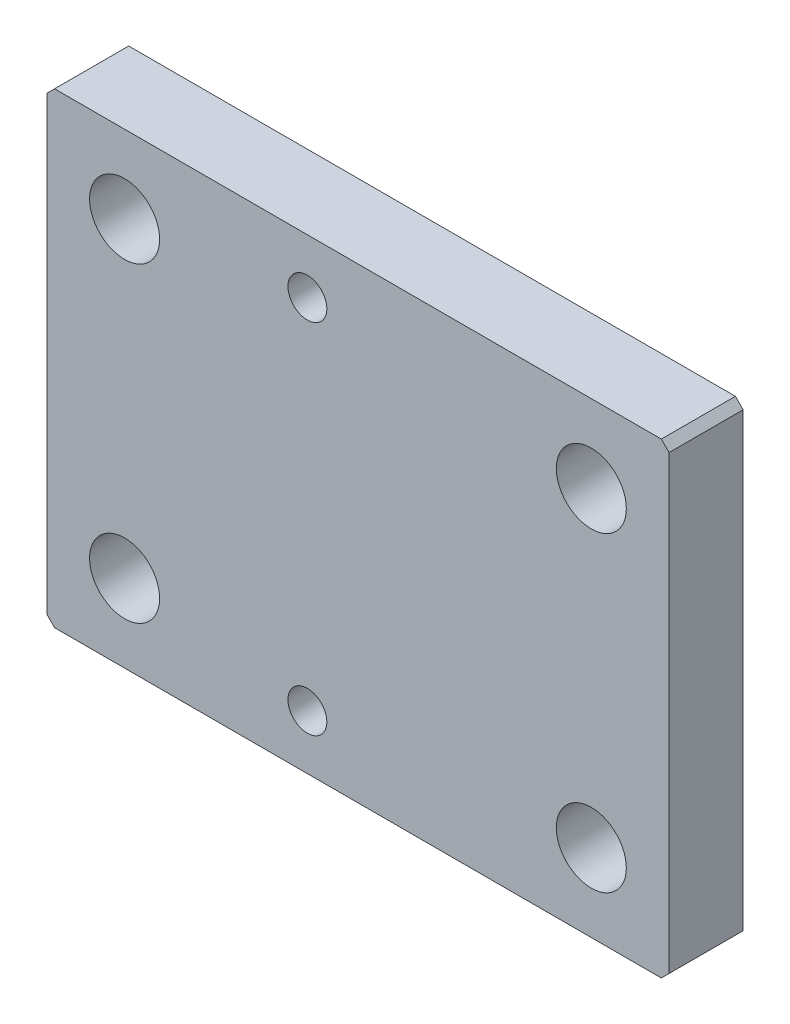
ISO-10303-21;
HEADER;
FILE_DESCRIPTION(('STEP AP214'),'2;1');
FILE_NAME('part.step','',(''),(''),'','','');
FILE_SCHEMA(('AUTOMOTIVE_DESIGN { 1 0 10303 214 1 1 1 1 }'));
ENDSEC;
DATA;
#1=APPLICATION_CONTEXT('core data for automotive mechanical design processes');
#2=APPLICATION_PROTOCOL_DEFINITION('international standard','automotive_design',2000,#1);
#3=PRODUCT_CONTEXT('',#1,'mechanical');
#4=PRODUCT('Part','Part','',(#3));
#5=PRODUCT_RELATED_PRODUCT_CATEGORY('part','',(#4));
#6=PRODUCT_DEFINITION_FORMATION('','',#4);
#7=PRODUCT_DEFINITION_CONTEXT('part definition',#1,'design');
#8=PRODUCT_DEFINITION('design','',#6,#7);
#9=PRODUCT_DEFINITION_SHAPE('','',#8);
#10=(LENGTH_UNIT() NAMED_UNIT(*) SI_UNIT(.MILLI.,.METRE.));
#11=(NAMED_UNIT(*) PLANE_ANGLE_UNIT() SI_UNIT($,.RADIAN.));
#12=(NAMED_UNIT(*) SI_UNIT($,.STERADIAN.) SOLID_ANGLE_UNIT());
#13=UNCERTAINTY_MEASURE_WITH_UNIT(LENGTH_MEASURE(1.E-05),#10,'distance_accuracy_value','');
#14=(GEOMETRIC_REPRESENTATION_CONTEXT(3) GLOBAL_UNCERTAINTY_ASSIGNED_CONTEXT((#13)) GLOBAL_UNIT_ASSIGNED_CONTEXT((#10,
#11,#12)) REPRESENTATION_CONTEXT('',''));
#15=CARTESIAN_POINT('',(0.,0.,0.));
#16=DIRECTION('',(0.,0.,1.));
#17=DIRECTION('',(1.,0.,0.));
#18=AXIS2_PLACEMENT_3D('',#15,#16,#17);
#19=CARTESIAN_POINT('',(0.,0.,4.7625));
#20=DIRECTION('',(0.,0.,-1.));
#21=DIRECTION('',(-1.,0.,0.));
#22=AXIS2_PLACEMENT_3D('',#19,#20,#21);
#23=PLANE('',#22);
#24=CARTESIAN_POINT('',(-6.50000000000001,-23.,4.7625));
#25=DIRECTION('',(0.,0.,1.));
#26=DIRECTION('',(1.,0.,0.));
#27=AXIS2_PLACEMENT_3D('',#24,#25,#26);
#28=CIRCLE('',#27,2.49999999999999);
#29=CARTESIAN_POINT('',(-4.00000000000002,-23.,4.7625));
#30=VERTEX_POINT('',#29);
#31=EDGE_CURVE('E260',#30,#30,#28,.T.);
#32=ORIENTED_EDGE('',*,*,#31,.F.);
#33=EDGE_LOOP('',(#32));
#34=FACE_BOUND('',#33,.T.);
#35=CARTESIAN_POINT('',(-30.,20.,4.7625));
#36=DIRECTION('',(0.,0.,1.));
#37=DIRECTION('',(1.,0.,0.));
#38=AXIS2_PLACEMENT_3D('',#35,#36,#37);
#39=CIRCLE('',#38,4.49999999999999);
#40=CARTESIAN_POINT('',(-25.5,20.,4.7625));
#41=VERTEX_POINT('',#40);
#42=EDGE_CURVE('E252',#41,#41,#39,.T.);
#43=ORIENTED_EDGE('',*,*,#42,.F.);
#44=EDGE_LOOP('',(#43));
#45=FACE_BOUND('',#44,.T.);
#46=CARTESIAN_POINT('',(30.,20.,4.7625));
#47=DIRECTION('',(0.,0.,1.));
#48=DIRECTION('',(1.,0.,0.));
#49=AXIS2_PLACEMENT_3D('',#46,#47,#48);
#50=CIRCLE('',#49,4.49999999999999);
#51=CARTESIAN_POINT('',(34.5,20.,4.7625));
#52=VERTEX_POINT('',#51);
#53=EDGE_CURVE('E244',#52,#52,#50,.T.);
#54=ORIENTED_EDGE('',*,*,#53,.F.);
#55=EDGE_LOOP('',(#54));
#56=FACE_BOUND('',#55,.T.);
#57=CARTESIAN_POINT('',(-30.,-20.,4.7625));
#58=DIRECTION('',(0.,0.,1.));
#59=DIRECTION('',(1.,0.,0.));
#60=AXIS2_PLACEMENT_3D('',#57,#58,#59);
#61=CIRCLE('',#60,4.49999999999999);
#62=CARTESIAN_POINT('',(-25.5,-20.,4.7625));
#63=VERTEX_POINT('',#62);
#64=EDGE_CURVE('E228',#63,#63,#61,.T.);
#65=ORIENTED_EDGE('',*,*,#64,.F.);
#66=EDGE_LOOP('',(#65));
#67=FACE_BOUND('',#66,.T.);
#68=DIRECTION('',(0.,-1.,0.));
#69=VECTOR('',#68,1.);
#70=CARTESIAN_POINT('',(-40.,30.,4.7625));
#71=LINE('',#70,#69);
#72=CARTESIAN_POINT('',(-40.,29.,4.7625));
#73=VERTEX_POINT('',#72);
#74=CARTESIAN_POINT('',(-40.,-29.0000000000001,4.7625));
#75=VERTEX_POINT('',#74);
#76=EDGE_CURVE('E158',#73,#75,#71,.T.);
#77=ORIENTED_EDGE('',*,*,#76,.T.);
#78=DIRECTION('',(-0.707106781186552,0.707106781186543,0.));
#79=VECTOR('',#78,1.);
#80=CARTESIAN_POINT('',(-39.,-30.0000000000001,4.7625));
#81=LINE('',#80,#79);
#82=CARTESIAN_POINT('',(-39.,-30.0000000000001,4.7625));
#83=VERTEX_POINT('',#82);
#84=EDGE_CURVE('E182',#75,#83,#81,.F.);
#85=ORIENTED_EDGE('',*,*,#84,.T.);
#86=DIRECTION('',(1.,0.,0.));
#87=VECTOR('',#86,1.);
#88=CARTESIAN_POINT('',(40.,-30.,4.7625));
#89=LINE('',#88,#87);
#90=CARTESIAN_POINT('',(39.,-30.,4.7625));
#91=VERTEX_POINT('',#90);
#92=EDGE_CURVE('E135',#83,#91,#89,.T.);
#93=ORIENTED_EDGE('',*,*,#92,.T.);
#94=DIRECTION('',(-0.707106781186548,-0.707106781186548,0.));
#95=VECTOR('',#94,1.);
#96=CARTESIAN_POINT('',(40.,-29.0000000000001,4.7625));
#97=LINE('',#96,#95);
#98=CARTESIAN_POINT('',(40.,-29.0000000000001,4.7625));
#99=VERTEX_POINT('',#98);
#100=EDGE_CURVE('E179',#91,#99,#97,.F.);
#101=ORIENTED_EDGE('',*,*,#100,.T.);
#102=DIRECTION('',(0.,1.,0.));
#103=VECTOR('',#102,1.);
#104=CARTESIAN_POINT('',(40.,30.,4.7625));
#105=LINE('',#104,#103);
#106=CARTESIAN_POINT('',(40.,29.,4.7625));
#107=VERTEX_POINT('',#106);
#108=EDGE_CURVE('E211',#99,#107,#105,.T.);
#109=ORIENTED_EDGE('',*,*,#108,.T.);
#110=DIRECTION('',(0.707106781186552,-0.707106781186543,0.));
#111=VECTOR('',#110,1.);
#112=CARTESIAN_POINT('',(39.,30.,4.7625));
#113=LINE('',#112,#111);
#114=CARTESIAN_POINT('',(39.,30.,4.7625));
#115=VERTEX_POINT('',#114);
#116=EDGE_CURVE('E69',#107,#115,#113,.F.);
#117=ORIENTED_EDGE('',*,*,#116,.T.);
#118=DIRECTION('',(-1.,0.,0.));
#119=VECTOR('',#118,1.);
#120=CARTESIAN_POINT('',(40.,30.,4.7625));
#121=LINE('',#120,#119);
#122=CARTESIAN_POINT('',(-39.,30.,4.7625));
#123=VERTEX_POINT('',#122);
#124=EDGE_CURVE('E160',#115,#123,#121,.T.);
#125=ORIENTED_EDGE('',*,*,#124,.T.);
#126=DIRECTION('',(0.707106781186552,0.707106781186543,0.));
#127=VECTOR('',#126,1.);
#128=CARTESIAN_POINT('',(-40.,29.,4.7625));
#129=LINE('',#128,#127);
#130=EDGE_CURVE('E174',#123,#73,#129,.F.);
#131=ORIENTED_EDGE('',*,*,#130,.T.);
#132=EDGE_LOOP('',(#77,#85,#93,#101,#109,#117,#125,#131));
#133=FACE_BOUND('',#132,.T.);
#134=CARTESIAN_POINT('',(30.,-20.,4.7625));
#135=DIRECTION('',(0.,0.,1.));
#136=DIRECTION('',(1.,0.,0.));
#137=AXIS2_PLACEMENT_3D('',#134,#135,#136);
#138=CIRCLE('',#137,4.49999999999999);
#139=CARTESIAN_POINT('',(34.5,-20.,4.7625));
#140=VERTEX_POINT('',#139);
#141=EDGE_CURVE('E236',#140,#140,#138,.T.);
#142=ORIENTED_EDGE('',*,*,#141,.F.);
#143=EDGE_LOOP('',(#142));
#144=FACE_BOUND('',#143,.T.);
#145=CARTESIAN_POINT('',(-6.50000000000001,23.,4.7625));
#146=DIRECTION('',(0.,0.,1.));
#147=DIRECTION('',(1.,0.,0.));
#148=AXIS2_PLACEMENT_3D('',#145,#146,#147);
#149=CIRCLE('',#148,2.49999999999999);
#150=CARTESIAN_POINT('',(-4.00000000000002,23.,4.7625));
#151=VERTEX_POINT('',#150);
#152=EDGE_CURVE('E268',#151,#151,#149,.T.);
#153=ORIENTED_EDGE('',*,*,#152,.F.);
#154=EDGE_LOOP('',(#153));
#155=FACE_BOUND('',#154,.T.);
#156=ADVANCED_FACE('F46',(#34,#45,#56,#67,#133,#144,#155),#23,.F.);
#157=CARTESIAN_POINT('',(-40.,30.,4.7625));
#158=DIRECTION('',(1.,0.,0.));
#159=DIRECTION('',(0.,1.,0.));
#160=AXIS2_PLACEMENT_3D('',#157,#158,#159);
#161=PLANE('',#160);
#162=DIRECTION('',(0.,-1.,0.));
#163=VECTOR('',#162,1.);
#164=CARTESIAN_POINT('',(-40.,30.,-4.7625));
#165=LINE('',#164,#163);
#166=CARTESIAN_POINT('',(-40.,29.,-4.7625));
#167=VERTEX_POINT('',#166);
#168=CARTESIAN_POINT('',(-40.,-29.0000000000001,-4.7625));
#169=VERTEX_POINT('',#168);
#170=EDGE_CURVE('E144',#167,#169,#165,.T.);
#171=ORIENTED_EDGE('',*,*,#170,.T.);
#172=DIRECTION('',(0.,0.,1.));
#173=VECTOR('',#172,1.);
#174=CARTESIAN_POINT('',(-40.,-29.0000000000001,4.7625));
#175=LINE('',#174,#173);
#176=EDGE_CURVE('E119',#169,#75,#175,.T.);
#177=ORIENTED_EDGE('',*,*,#176,.T.);
#178=ORIENTED_EDGE('',*,*,#76,.F.);
#179=DIRECTION('',(0.,0.,-1.));
#180=VECTOR('',#179,1.);
#181=CARTESIAN_POINT('',(-40.,29.,4.7625));
#182=LINE('',#181,#180);
#183=EDGE_CURVE('E125',#73,#167,#182,.T.);
#184=ORIENTED_EDGE('',*,*,#183,.T.);
#185=EDGE_LOOP('',(#171,#177,#178,#184));
#186=FACE_BOUND('',#185,.T.);
#187=ADVANCED_FACE('F278',(#186),#161,.F.);
#188=CARTESIAN_POINT('',(40.,-30.,4.7625));
#189=DIRECTION('',(0.,1.,0.));
#190=DIRECTION('',(-1.,0.,0.));
#191=AXIS2_PLACEMENT_3D('',#188,#189,#190);
#192=PLANE('',#191);
#193=ORIENTED_EDGE('',*,*,#92,.F.);
#194=DIRECTION('',(0.,0.,-1.));
#195=VECTOR('',#194,1.);
#196=CARTESIAN_POINT('',(-39.,-30.0000000000001,4.7625));
#197=LINE('',#196,#195);
#198=CARTESIAN_POINT('',(-39.,-30.,-4.7625));
#199=VERTEX_POINT('',#198);
#200=EDGE_CURVE('E118',#83,#199,#197,.T.);
#201=ORIENTED_EDGE('',*,*,#200,.T.);
#202=DIRECTION('',(1.,0.,0.));
#203=VECTOR('',#202,1.);
#204=CARTESIAN_POINT('',(40.,-30.,-4.7625));
#205=LINE('',#204,#203);
#206=CARTESIAN_POINT('',(39.,-30.,-4.7625));
#207=VERTEX_POINT('',#206);
#208=EDGE_CURVE('E132',#199,#207,#205,.T.);
#209=ORIENTED_EDGE('',*,*,#208,.T.);
#210=DIRECTION('',(0.,0.,1.));
#211=VECTOR('',#210,1.);
#212=CARTESIAN_POINT('',(39.,-30.,4.7625));
#213=LINE('',#212,#211);
#214=EDGE_CURVE('E138',#207,#91,#213,.T.);
#215=ORIENTED_EDGE('',*,*,#214,.T.);
#216=EDGE_LOOP('',(#193,#201,#209,#215));
#217=FACE_BOUND('',#216,.T.);
#218=ADVANCED_FACE('F131',(#217),#192,.F.);
#219=CARTESIAN_POINT('',(40.,30.,4.7625));
#220=DIRECTION('',(-1.,0.,0.));
#221=DIRECTION('',(0.,0.,1.));
#222=AXIS2_PLACEMENT_3D('',#219,#220,#221);
#223=PLANE('',#222);
#224=ORIENTED_EDGE('',*,*,#108,.F.);
#225=DIRECTION('',(0.,0.,-1.));
#226=VECTOR('',#225,1.);
#227=CARTESIAN_POINT('',(40.,-29.0000000000001,4.7625));
#228=LINE('',#227,#226);
#229=CARTESIAN_POINT('',(40.,-29.,-4.7625));
#230=VERTEX_POINT('',#229);
#231=EDGE_CURVE('E188',#99,#230,#228,.T.);
#232=ORIENTED_EDGE('',*,*,#231,.T.);
#233=DIRECTION('',(0.,1.,0.));
#234=VECTOR('',#233,1.);
#235=CARTESIAN_POINT('',(40.,30.,-4.7625));
#236=LINE('',#235,#234);
#237=CARTESIAN_POINT('',(40.,29.,-4.7625));
#238=VERTEX_POINT('',#237);
#239=EDGE_CURVE('E143',#230,#238,#236,.T.);
#240=ORIENTED_EDGE('',*,*,#239,.T.);
#241=DIRECTION('',(0.,0.,1.));
#242=VECTOR('',#241,1.);
#243=CARTESIAN_POINT('',(40.,29.,4.7625));
#244=LINE('',#243,#242);
#245=EDGE_CURVE('E185',#238,#107,#244,.T.);
#246=ORIENTED_EDGE('',*,*,#245,.T.);
#247=EDGE_LOOP('',(#224,#232,#240,#246));
#248=FACE_BOUND('',#247,.T.);
#249=ADVANCED_FACE('F298',(#248),#223,.F.);
#250=CARTESIAN_POINT('',(40.,30.,4.7625));
#251=DIRECTION('',(0.,-1.,0.));
#252=DIRECTION('',(0.,0.,-1.));
#253=AXIS2_PLACEMENT_3D('',#250,#251,#252);
#254=PLANE('',#253);
#255=ORIENTED_EDGE('',*,*,#124,.F.);
#256=DIRECTION('',(0.,0.,-1.));
#257=VECTOR('',#256,1.);
#258=CARTESIAN_POINT('',(39.,30.,4.7625));
#259=LINE('',#258,#257);
#260=CARTESIAN_POINT('',(39.,30.,-4.7625));
#261=VERTEX_POINT('',#260);
#262=EDGE_CURVE('E11',#115,#261,#259,.T.);
#263=ORIENTED_EDGE('',*,*,#262,.T.);
#264=DIRECTION('',(-1.,0.,0.));
#265=VECTOR('',#264,1.);
#266=CARTESIAN_POINT('',(40.,30.,-4.7625));
#267=LINE('',#266,#265);
#268=CARTESIAN_POINT('',(-39.,30.,-4.7625));
#269=VERTEX_POINT('',#268);
#270=EDGE_CURVE('E150',#261,#269,#267,.T.);
#271=ORIENTED_EDGE('',*,*,#270,.T.);
#272=DIRECTION('',(0.,0.,1.));
#273=VECTOR('',#272,1.);
#274=CARTESIAN_POINT('',(-39.,30.,4.7625));
#275=LINE('',#274,#273);
#276=EDGE_CURVE('E56',#269,#123,#275,.T.);
#277=ORIENTED_EDGE('',*,*,#276,.T.);
#278=EDGE_LOOP('',(#255,#263,#271,#277));
#279=FACE_BOUND('',#278,.T.);
#280=ADVANCED_FACE('F294',(#279),#254,.F.);
#281=CARTESIAN_POINT('',(0.,0.,-4.7625));
#282=DIRECTION('',(0.,0.,-1.));
#283=DIRECTION('',(-1.,0.,0.));
#284=AXIS2_PLACEMENT_3D('',#281,#282,#283);
#285=PLANE('',#284);
#286=CARTESIAN_POINT('',(-6.50000000000001,23.,-4.7625));
#287=DIRECTION('',(0.,0.,-1.));
#288=DIRECTION('',(-1.,0.,0.));
#289=AXIS2_PLACEMENT_3D('',#286,#287,#288);
#290=CIRCLE('',#289,2.49999999999999);
#291=CARTESIAN_POINT('',(-9.,23.,-4.7625));
#292=VERTEX_POINT('',#291);
#293=EDGE_CURVE('E264',#292,#292,#290,.T.);
#294=ORIENTED_EDGE('',*,*,#293,.F.);
#295=EDGE_LOOP('',(#294));
#296=FACE_BOUND('',#295,.T.);
#297=CARTESIAN_POINT('',(-6.50000000000001,-23.,-4.7625));
#298=DIRECTION('',(0.,0.,-1.));
#299=DIRECTION('',(-1.,0.,0.));
#300=AXIS2_PLACEMENT_3D('',#297,#298,#299);
#301=CIRCLE('',#300,2.49999999999999);
#302=CARTESIAN_POINT('',(-9.,-23.,-4.7625));
#303=VERTEX_POINT('',#302);
#304=EDGE_CURVE('E256',#303,#303,#301,.T.);
#305=ORIENTED_EDGE('',*,*,#304,.F.);
#306=EDGE_LOOP('',(#305));
#307=FACE_BOUND('',#306,.T.);
#308=CARTESIAN_POINT('',(-30.,20.,-4.7625));
#309=DIRECTION('',(0.,0.,-1.));
#310=DIRECTION('',(-1.,0.,0.));
#311=AXIS2_PLACEMENT_3D('',#308,#309,#310);
#312=CIRCLE('',#311,4.49999999999999);
#313=CARTESIAN_POINT('',(-34.5,20.,-4.7625));
#314=VERTEX_POINT('',#313);
#315=EDGE_CURVE('E248',#314,#314,#312,.T.);
#316=ORIENTED_EDGE('',*,*,#315,.F.);
#317=EDGE_LOOP('',(#316));
#318=FACE_BOUND('',#317,.T.);
#319=CARTESIAN_POINT('',(30.,20.,-4.7625));
#320=DIRECTION('',(0.,0.,-1.));
#321=DIRECTION('',(-1.,0.,0.));
#322=AXIS2_PLACEMENT_3D('',#319,#320,#321);
#323=CIRCLE('',#322,4.49999999999999);
#324=CARTESIAN_POINT('',(25.5,20.,-4.7625));
#325=VERTEX_POINT('',#324);
#326=EDGE_CURVE('E240',#325,#325,#323,.T.);
#327=ORIENTED_EDGE('',*,*,#326,.F.);
#328=EDGE_LOOP('',(#327));
#329=FACE_BOUND('',#328,.T.);
#330=CARTESIAN_POINT('',(30.,-20.,-4.7625));
#331=DIRECTION('',(0.,0.,-1.));
#332=DIRECTION('',(-1.,0.,0.));
#333=AXIS2_PLACEMENT_3D('',#330,#331,#332);
#334=CIRCLE('',#333,4.49999999999999);
#335=CARTESIAN_POINT('',(25.5,-20.,-4.7625));
#336=VERTEX_POINT('',#335);
#337=EDGE_CURVE('E232',#336,#336,#334,.T.);
#338=ORIENTED_EDGE('',*,*,#337,.F.);
#339=EDGE_LOOP('',(#338));
#340=FACE_BOUND('',#339,.T.);
#341=CARTESIAN_POINT('',(-30.,-20.,-4.7625));
#342=DIRECTION('',(0.,0.,-1.));
#343=DIRECTION('',(-1.,0.,0.));
#344=AXIS2_PLACEMENT_3D('',#341,#342,#343);
#345=CIRCLE('',#344,4.49999999999999);
#346=CARTESIAN_POINT('',(-34.5,-20.,-4.7625));
#347=VERTEX_POINT('',#346);
#348=EDGE_CURVE('E152',#347,#347,#345,.T.);
#349=ORIENTED_EDGE('',*,*,#348,.F.);
#350=EDGE_LOOP('',(#349));
#351=FACE_BOUND('',#350,.T.);
#352=ORIENTED_EDGE('',*,*,#208,.F.);
#353=DIRECTION('',(0.707106781186552,-0.707106781186543,0.));
#354=VECTOR('',#353,1.);
#355=CARTESIAN_POINT('',(-34.4999999999998,-34.5000000000002,-4.7625));
#356=LINE('',#355,#354);
#357=EDGE_CURVE('E114',#199,#169,#356,.F.);
#358=ORIENTED_EDGE('',*,*,#357,.T.);
#359=ORIENTED_EDGE('',*,*,#170,.F.);
#360=DIRECTION('',(-0.707106781186552,-0.707106781186543,0.));
#361=VECTOR('',#360,1.);
#362=CARTESIAN_POINT('',(-34.4999999999997,34.5000000000002,-4.7625));
#363=LINE('',#362,#361);
#364=EDGE_CURVE('E137',#167,#269,#363,.F.);
#365=ORIENTED_EDGE('',*,*,#364,.T.);
#366=ORIENTED_EDGE('',*,*,#270,.F.);
#367=DIRECTION('',(-0.707106781186552,0.707106781186543,0.));
#368=VECTOR('',#367,1.);
#369=CARTESIAN_POINT('',(34.4999999999998,34.5000000000002,-4.7625));
#370=LINE('',#369,#368);
#371=EDGE_CURVE('E164',#261,#238,#370,.F.);
#372=ORIENTED_EDGE('',*,*,#371,.T.);
#373=ORIENTED_EDGE('',*,*,#239,.F.);
#374=DIRECTION('',(0.707106781186548,0.707106781186548,0.));
#375=VECTOR('',#374,1.);
#376=CARTESIAN_POINT('',(34.5,-34.5,-4.7625));
#377=LINE('',#376,#375);
#378=EDGE_CURVE('E126',#230,#207,#377,.F.);
#379=ORIENTED_EDGE('',*,*,#378,.T.);
#380=EDGE_LOOP('',(#352,#358,#359,#365,#366,#372,#373,#379));
#381=FACE_BOUND('',#380,.T.);
#382=ADVANCED_FACE('F140',(#296,#307,#318,#329,#340,#351,#381),#285,.T.);
#383=CARTESIAN_POINT('',(-30.,-20.,4.7625));
#384=DIRECTION('',(0.,0.,1.));
#385=DIRECTION('',(1.,0.,0.));
#386=AXIS2_PLACEMENT_3D('',#383,#384,#385);
#387=CYLINDRICAL_SURFACE('',#386,4.49999999999999);
#388=ORIENTED_EDGE('',*,*,#64,.T.);
#389=EDGE_LOOP('',(#388));
#390=FACE_BOUND('',#389,.T.);
#391=ORIENTED_EDGE('',*,*,#348,.T.);
#392=EDGE_LOOP('',(#391));
#393=FACE_BOUND('',#392,.T.);
#394=ADVANCED_FACE('F290',(#390,#393),#387,.F.);
#395=CARTESIAN_POINT('',(30.,-20.,4.7625));
#396=DIRECTION('',(0.,0.,1.));
#397=DIRECTION('',(1.,0.,0.));
#398=AXIS2_PLACEMENT_3D('',#395,#396,#397);
#399=CYLINDRICAL_SURFACE('',#398,4.49999999999999);
#400=ORIENTED_EDGE('',*,*,#141,.T.);
#401=EDGE_LOOP('',(#400));
#402=FACE_BOUND('',#401,.T.);
#403=ORIENTED_EDGE('',*,*,#337,.T.);
#404=EDGE_LOOP('',(#403));
#405=FACE_BOUND('',#404,.T.);
#406=ADVANCED_FACE('F333',(#402,#405),#399,.F.);
#407=CARTESIAN_POINT('',(30.,20.,4.7625));
#408=DIRECTION('',(0.,0.,1.));
#409=DIRECTION('',(1.,0.,0.));
#410=AXIS2_PLACEMENT_3D('',#407,#408,#409);
#411=CYLINDRICAL_SURFACE('',#410,4.49999999999999);
#412=ORIENTED_EDGE('',*,*,#53,.T.);
#413=EDGE_LOOP('',(#412));
#414=FACE_BOUND('',#413,.T.);
#415=ORIENTED_EDGE('',*,*,#326,.T.);
#416=EDGE_LOOP('',(#415));
#417=FACE_BOUND('',#416,.T.);
#418=ADVANCED_FACE('F336',(#414,#417),#411,.F.);
#419=CARTESIAN_POINT('',(-30.,20.,4.7625));
#420=DIRECTION('',(0.,0.,1.));
#421=DIRECTION('',(1.,0.,0.));
#422=AXIS2_PLACEMENT_3D('',#419,#420,#421);
#423=CYLINDRICAL_SURFACE('',#422,4.49999999999999);
#424=ORIENTED_EDGE('',*,*,#42,.T.);
#425=EDGE_LOOP('',(#424));
#426=FACE_BOUND('',#425,.T.);
#427=ORIENTED_EDGE('',*,*,#315,.T.);
#428=EDGE_LOOP('',(#427));
#429=FACE_BOUND('',#428,.T.);
#430=ADVANCED_FACE('F360',(#426,#429),#423,.F.);
#431=CARTESIAN_POINT('',(-6.50000000000001,-23.,4.7625));
#432=DIRECTION('',(0.,0.,1.));
#433=DIRECTION('',(1.,0.,0.));
#434=AXIS2_PLACEMENT_3D('',#431,#432,#433);
#435=CYLINDRICAL_SURFACE('',#434,2.49999999999999);
#436=ORIENTED_EDGE('',*,*,#31,.T.);
#437=EDGE_LOOP('',(#436));
#438=FACE_BOUND('',#437,.T.);
#439=ORIENTED_EDGE('',*,*,#304,.T.);
#440=EDGE_LOOP('',(#439));
#441=FACE_BOUND('',#440,.T.);
#442=ADVANCED_FACE('F368',(#438,#441),#435,.F.);
#443=CARTESIAN_POINT('',(-6.50000000000001,23.,4.7625));
#444=DIRECTION('',(0.,0.,1.));
#445=DIRECTION('',(1.,0.,0.));
#446=AXIS2_PLACEMENT_3D('',#443,#444,#445);
#447=CYLINDRICAL_SURFACE('',#446,2.49999999999999);
#448=ORIENTED_EDGE('',*,*,#152,.T.);
#449=EDGE_LOOP('',(#448));
#450=FACE_BOUND('',#449,.T.);
#451=ORIENTED_EDGE('',*,*,#293,.T.);
#452=EDGE_LOOP('',(#451));
#453=FACE_BOUND('',#452,.T.);
#454=ADVANCED_FACE('F274',(#450,#453),#447,.F.);
#455=CARTESIAN_POINT('',(-39.,-30.0000000000001,4.7625));
#456=DIRECTION('',(0.707106781186543,0.707106781186552,0.));
#457=DIRECTION('',(0.,0.,-1.));
#458=AXIS2_PLACEMENT_3D('',#455,#456,#457);
#459=PLANE('',#458);
#460=ORIENTED_EDGE('',*,*,#84,.F.);
#461=ORIENTED_EDGE('',*,*,#176,.F.);
#462=ORIENTED_EDGE('',*,*,#357,.F.);
#463=ORIENTED_EDGE('',*,*,#200,.F.);
#464=EDGE_LOOP('',(#460,#461,#462,#463));
#465=FACE_BOUND('',#464,.T.);
#466=ADVANCED_FACE('F117',(#465),#459,.F.);
#467=CARTESIAN_POINT('',(40.,-29.0000000000001,4.7625));
#468=DIRECTION('',(-0.707106781186547,0.707106781186547,0.));
#469=DIRECTION('',(0.,0.,-1.));
#470=AXIS2_PLACEMENT_3D('',#467,#468,#469);
#471=PLANE('',#470);
#472=ORIENTED_EDGE('',*,*,#100,.F.);
#473=ORIENTED_EDGE('',*,*,#214,.F.);
#474=ORIENTED_EDGE('',*,*,#378,.F.);
#475=ORIENTED_EDGE('',*,*,#231,.F.);
#476=EDGE_LOOP('',(#472,#473,#474,#475));
#477=FACE_BOUND('',#476,.T.);
#478=ADVANCED_FACE('F310',(#477),#471,.F.);
#479=CARTESIAN_POINT('',(39.,30.,4.7625));
#480=DIRECTION('',(-0.707106781186543,-0.707106781186552,0.));
#481=DIRECTION('',(0.,0.,-1.));
#482=AXIS2_PLACEMENT_3D('',#479,#480,#481);
#483=PLANE('',#482);
#484=ORIENTED_EDGE('',*,*,#116,.F.);
#485=ORIENTED_EDGE('',*,*,#245,.F.);
#486=ORIENTED_EDGE('',*,*,#371,.F.);
#487=ORIENTED_EDGE('',*,*,#262,.F.);
#488=EDGE_LOOP('',(#484,#485,#486,#487));
#489=FACE_BOUND('',#488,.T.);
#490=ADVANCED_FACE('F315',(#489),#483,.F.);
#491=CARTESIAN_POINT('',(-40.,29.,4.7625));
#492=DIRECTION('',(0.707106781186542,-0.707106781186552,0.));
#493=DIRECTION('',(0.,0.,-1.));
#494=AXIS2_PLACEMENT_3D('',#491,#492,#493);
#495=PLANE('',#494);
#496=ORIENTED_EDGE('',*,*,#130,.F.);
#497=ORIENTED_EDGE('',*,*,#276,.F.);
#498=ORIENTED_EDGE('',*,*,#364,.F.);
#499=ORIENTED_EDGE('',*,*,#183,.F.);
#500=EDGE_LOOP('',(#496,#497,#498,#499));
#501=FACE_BOUND('',#500,.T.);
#502=ADVANCED_FACE('F49',(#501),#495,.F.);
#503=CLOSED_SHELL('',(#156,#187,#218,#249,#280,#382,#394,#406,#418,#430,#442,#454,#466,#478,
#490,#502));
#504=MANIFOLD_SOLID_BREP('B2',#503);
#505=ADVANCED_BREP_SHAPE_REPRESENTATION('',(#18,#504),#14);
#506=SHAPE_DEFINITION_REPRESENTATION(#9,#505);
ENDSEC;
END-ISO-10303-21;
